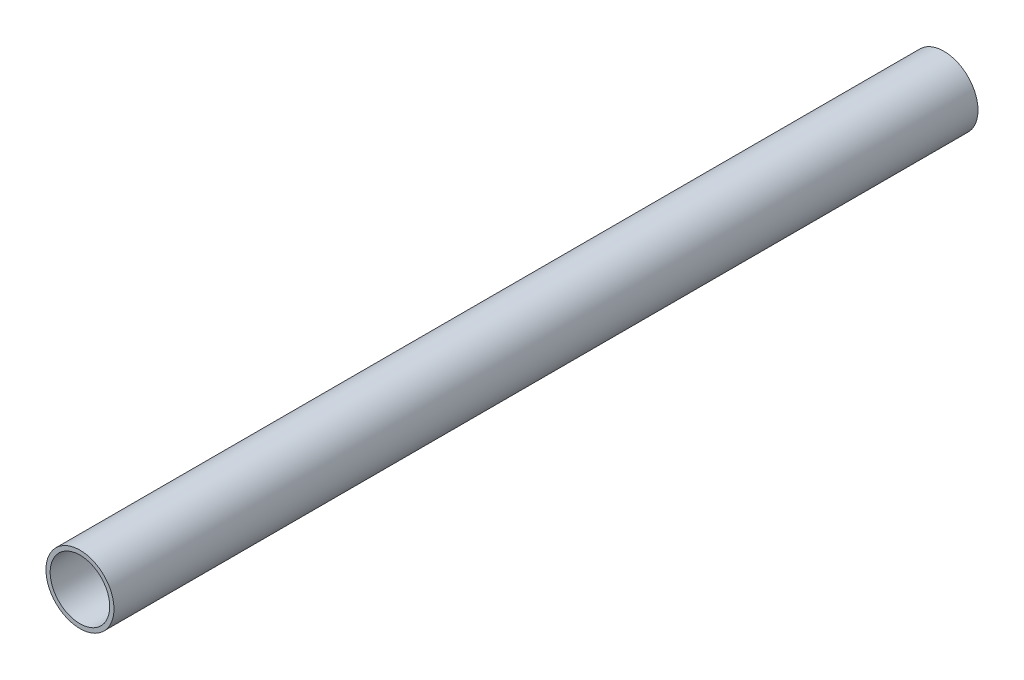
ISO-10303-21;
HEADER;
FILE_DESCRIPTION(('STEP AP214'),'2;1');
FILE_NAME('part.step','',(''),(''),'','','');
FILE_SCHEMA(('AUTOMOTIVE_DESIGN { 1 0 10303 214 1 1 1 1 }'));
ENDSEC;
DATA;
#1=APPLICATION_CONTEXT('core data for automotive mechanical design processes');
#2=APPLICATION_PROTOCOL_DEFINITION('international standard','automotive_design',2000,#1);
#3=PRODUCT_CONTEXT('',#1,'mechanical');
#4=PRODUCT('Part','Part','',(#3));
#5=PRODUCT_RELATED_PRODUCT_CATEGORY('part','',(#4));
#6=PRODUCT_DEFINITION_FORMATION('','',#4);
#7=PRODUCT_DEFINITION_CONTEXT('part definition',#1,'design');
#8=PRODUCT_DEFINITION('design','',#6,#7);
#9=PRODUCT_DEFINITION_SHAPE('','',#8);
#10=(LENGTH_UNIT() NAMED_UNIT(*) SI_UNIT(.MILLI.,.METRE.));
#11=(NAMED_UNIT(*) PLANE_ANGLE_UNIT() SI_UNIT($,.RADIAN.));
#12=(NAMED_UNIT(*) SI_UNIT($,.STERADIAN.) SOLID_ANGLE_UNIT());
#13=UNCERTAINTY_MEASURE_WITH_UNIT(LENGTH_MEASURE(1.E-05),#10,'distance_accuracy_value','');
#14=(GEOMETRIC_REPRESENTATION_CONTEXT(3) GLOBAL_UNCERTAINTY_ASSIGNED_CONTEXT((#13)) GLOBAL_UNIT_ASSIGNED_CONTEXT((#10,
#11,#12)) REPRESENTATION_CONTEXT('',''));
#15=CARTESIAN_POINT('',(0.,0.,0.));
#16=DIRECTION('',(0.,0.,1.));
#17=DIRECTION('',(1.,0.,0.));
#18=AXIS2_PLACEMENT_3D('',#15,#16,#17);
#19=CARTESIAN_POINT('',(0.,0.,101.6));
#20=DIRECTION('',(0.,0.,1.));
#21=DIRECTION('',(1.,0.,0.));
#22=AXIS2_PLACEMENT_3D('',#19,#20,#21);
#23=PLANE('',#22);
#24=CARTESIAN_POINT('',(0.,0.,101.6));
#25=DIRECTION('',(0.,0.,1.));
#26=DIRECTION('',(1.,0.,0.));
#27=AXIS2_PLACEMENT_3D('',#24,#25,#26);
#28=CIRCLE('',#27,8.);
#29=CARTESIAN_POINT('',(8.,0.,101.6));
#30=VERTEX_POINT('',#29);
#31=EDGE_CURVE('E10',#30,#30,#28,.T.);
#32=ORIENTED_EDGE('',*,*,#31,.T.);
#33=EDGE_LOOP('',(#32));
#34=FACE_BOUND('',#33,.T.);
#35=CARTESIAN_POINT('',(0.,0.,101.6));
#36=DIRECTION('',(0.,0.,1.));
#37=DIRECTION('',(1.,0.,0.));
#38=AXIS2_PLACEMENT_3D('',#35,#36,#37);
#39=CIRCLE('',#38,7.);
#40=CARTESIAN_POINT('',(7.,0.,101.6));
#41=VERTEX_POINT('',#40);
#42=EDGE_CURVE('E42',#41,#41,#39,.T.);
#43=ORIENTED_EDGE('',*,*,#42,.F.);
#44=EDGE_LOOP('',(#43));
#45=FACE_BOUND('',#44,.T.);
#46=ADVANCED_FACE('F31',(#34,#45),#23,.T.);
#47=CARTESIAN_POINT('',(0.,0.,-101.6));
#48=DIRECTION('',(0.,0.,1.));
#49=DIRECTION('',(1.,0.,0.));
#50=AXIS2_PLACEMENT_3D('',#47,#48,#49);
#51=PLANE('',#50);
#52=CARTESIAN_POINT('',(0.,0.,-101.6));
#53=DIRECTION('',(0.,0.,1.));
#54=DIRECTION('',(1.,0.,0.));
#55=AXIS2_PLACEMENT_3D('',#52,#53,#54);
#56=CIRCLE('',#55,8.);
#57=CARTESIAN_POINT('',(8.,0.,-101.6));
#58=VERTEX_POINT('',#57);
#59=EDGE_CURVE('E35',#58,#58,#56,.T.);
#60=ORIENTED_EDGE('',*,*,#59,.F.);
#61=EDGE_LOOP('',(#60));
#62=FACE_BOUND('',#61,.T.);
#63=CARTESIAN_POINT('',(0.,0.,-101.6));
#64=DIRECTION('',(0.,0.,1.));
#65=DIRECTION('',(1.,0.,0.));
#66=AXIS2_PLACEMENT_3D('',#63,#64,#65);
#67=CIRCLE('',#66,7.);
#68=CARTESIAN_POINT('',(7.,0.,-101.6));
#69=VERTEX_POINT('',#68);
#70=EDGE_CURVE('E44',#69,#69,#67,.T.);
#71=ORIENTED_EDGE('',*,*,#70,.T.);
#72=EDGE_LOOP('',(#71));
#73=FACE_BOUND('',#72,.T.);
#74=ADVANCED_FACE('F54',(#62,#73),#51,.F.);
#75=CARTESIAN_POINT('',(0.,0.,101.6));
#76=DIRECTION('',(0.,0.,-1.));
#77=DIRECTION('',(-1.,0.,0.));
#78=AXIS2_PLACEMENT_3D('',#75,#76,#77);
#79=CYLINDRICAL_SURFACE('',#78,8.);
#80=ORIENTED_EDGE('',*,*,#31,.F.);
#81=EDGE_LOOP('',(#80));
#82=FACE_BOUND('',#81,.T.);
#83=ORIENTED_EDGE('',*,*,#59,.T.);
#84=EDGE_LOOP('',(#83));
#85=FACE_BOUND('',#84,.T.);
#86=ADVANCED_FACE('F33',(#82,#85),#79,.T.);
#87=CARTESIAN_POINT('',(0.,0.,101.6));
#88=DIRECTION('',(0.,0.,-1.));
#89=DIRECTION('',(-1.,0.,0.));
#90=AXIS2_PLACEMENT_3D('',#87,#88,#89);
#91=CYLINDRICAL_SURFACE('',#90,7.);
#92=ORIENTED_EDGE('',*,*,#42,.T.);
#93=EDGE_LOOP('',(#92));
#94=FACE_BOUND('',#93,.T.);
#95=ORIENTED_EDGE('',*,*,#70,.F.);
#96=EDGE_LOOP('',(#95));
#97=FACE_BOUND('',#96,.T.);
#98=ADVANCED_FACE('F50',(#94,#97),#91,.F.);
#99=CLOSED_SHELL('',(#46,#74,#86,#98));
#100=MANIFOLD_SOLID_BREP('B2',#99);
#101=ADVANCED_BREP_SHAPE_REPRESENTATION('',(#18,#100),#14);
#102=SHAPE_DEFINITION_REPRESENTATION(#9,#101);
ENDSEC;
END-ISO-10303-21;
